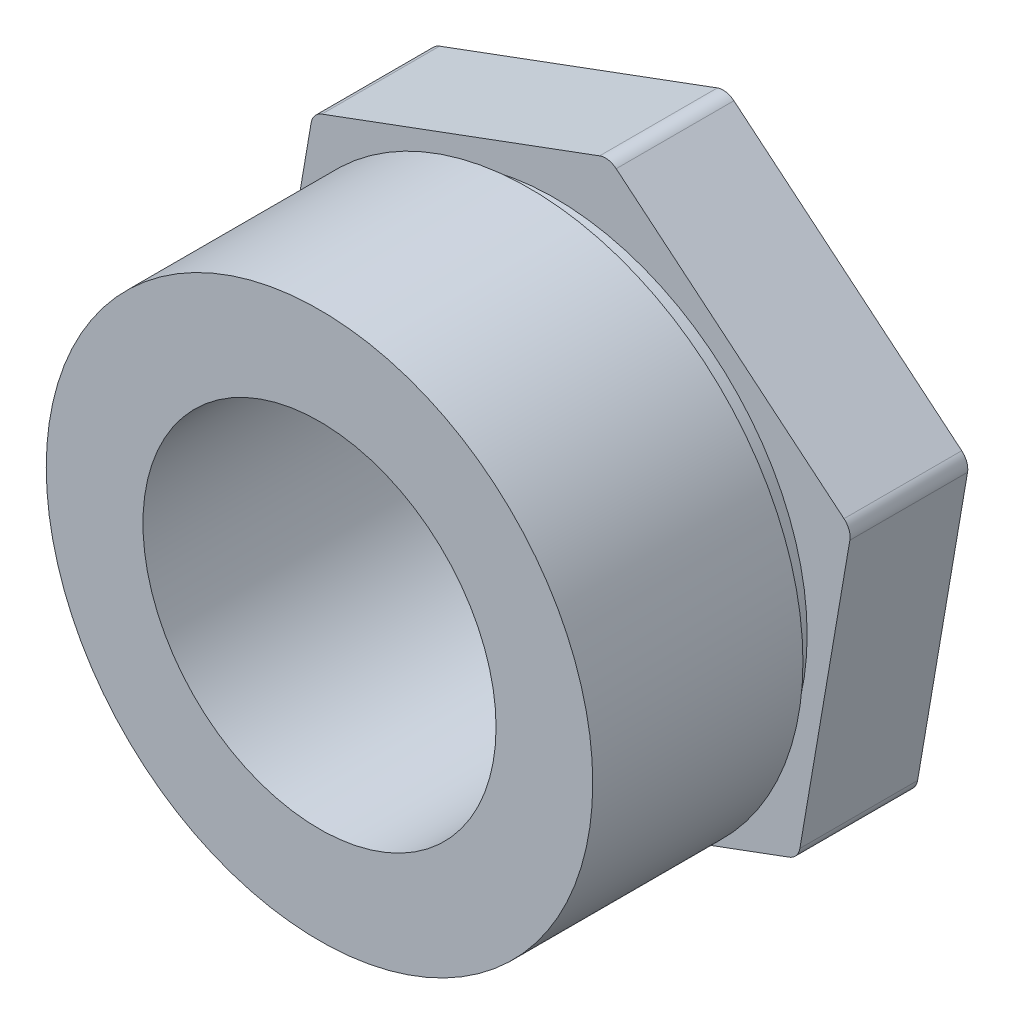
ISO-10303-21;
HEADER;
FILE_DESCRIPTION(('STEP AP214'),'2;1');
FILE_NAME('part.step','',(''),(''),'','','');
FILE_SCHEMA(('AUTOMOTIVE_DESIGN { 1 0 10303 214 1 1 1 1 }'));
ENDSEC;
DATA;
#1=APPLICATION_CONTEXT('core data for automotive mechanical design processes');
#2=APPLICATION_PROTOCOL_DEFINITION('international standard','automotive_design',2000,#1);
#3=PRODUCT_CONTEXT('',#1,'mechanical');
#4=PRODUCT('Part','Part','',(#3));
#5=PRODUCT_RELATED_PRODUCT_CATEGORY('part','',(#4));
#6=PRODUCT_DEFINITION_FORMATION('','',#4);
#7=PRODUCT_DEFINITION_CONTEXT('part definition',#1,'design');
#8=PRODUCT_DEFINITION('design','',#6,#7);
#9=PRODUCT_DEFINITION_SHAPE('','',#8);
#10=(LENGTH_UNIT() NAMED_UNIT(*) SI_UNIT(.MILLI.,.METRE.));
#11=(NAMED_UNIT(*) PLANE_ANGLE_UNIT() SI_UNIT($,.RADIAN.));
#12=(NAMED_UNIT(*) SI_UNIT($,.STERADIAN.) SOLID_ANGLE_UNIT());
#13=UNCERTAINTY_MEASURE_WITH_UNIT(LENGTH_MEASURE(1.E-05),#10,'distance_accuracy_value','');
#14=(GEOMETRIC_REPRESENTATION_CONTEXT(3) GLOBAL_UNCERTAINTY_ASSIGNED_CONTEXT((#13)) GLOBAL_UNIT_ASSIGNED_CONTEXT((#10,
#11,#12)) REPRESENTATION_CONTEXT('',''));
#15=CARTESIAN_POINT('',(0.,0.,0.));
#16=DIRECTION('',(0.,0.,1.));
#17=DIRECTION('',(1.,0.,0.));
#18=AXIS2_PLACEMENT_3D('',#15,#16,#17);
#19=CARTESIAN_POINT('',(0.,0.,42.));
#20=DIRECTION('',(0.,0.,-1.));
#21=DIRECTION('',(-1.,0.,0.));
#22=AXIS2_PLACEMENT_3D('',#19,#20,#21);
#23=CYLINDRICAL_SURFACE('',#22,32.5);
#24=CARTESIAN_POINT('',(0.,0.,14.));
#25=DIRECTION('',(0.,0.,1.));
#26=DIRECTION('',(1.,0.,0.));
#27=AXIS2_PLACEMENT_3D('',#24,#25,#26);
#28=CIRCLE('',#27,32.5);
#29=CARTESIAN_POINT('',(-24.267873622289,-21.6175926007641,14.));
#30=VERTEX_POINT('',#29);
#31=CARTESIAN_POINT('',(-16.7928416207255,-27.8253566069014,14.));
#32=VERTEX_POINT('',#31);
#33=EDGE_CURVE('E207',#30,#32,#28,.T.);
#34=ORIENTED_EDGE('',*,*,#33,.F.);
#35=DIRECTION('',(0.,0.,-1.));
#36=VECTOR('',#35,1.);
#37=CARTESIAN_POINT('',(-24.267873622289,-21.6175926007641,42.));
#38=LINE('',#37,#36);
#39=CARTESIAN_POINT('',(-24.267873622289,-21.6175926007641,0.));
#40=VERTEX_POINT('',#39);
#41=EDGE_CURVE('E215',#30,#40,#38,.T.);
#42=ORIENTED_EDGE('',*,*,#41,.T.);
#43=CARTESIAN_POINT('',(0.,0.,0.));
#44=DIRECTION('',(0.,0.,1.));
#45=DIRECTION('',(1.,0.,0.));
#46=AXIS2_PLACEMENT_3D('',#43,#44,#45);
#47=CIRCLE('',#46,32.5);
#48=CARTESIAN_POINT('',(-16.7928416207255,-27.8253566069014,0.));
#49=VERTEX_POINT('',#48);
#50=EDGE_CURVE('E163',#40,#49,#47,.T.);
#51=ORIENTED_EDGE('',*,*,#50,.T.);
#52=DIRECTION('',(0.,0.,-1.));
#53=VECTOR('',#52,1.);
#54=CARTESIAN_POINT('',(-16.7928416207255,-27.8253566069014,42.));
#55=LINE('',#54,#53);
#56=EDGE_CURVE('E174',#49,#32,#55,.F.);
#57=ORIENTED_EDGE('',*,*,#56,.T.);
#58=EDGE_LOOP('',(#34,#42,#51,#57));
#59=FACE_BOUND('',#58,.T.);
#60=ADVANCED_FACE('F39',(#59),#23,.T.);
#61=CARTESIAN_POINT('',(0.,0.,17.));
#62=DIRECTION('',(0.,0.,1.));
#63=DIRECTION('',(1.,0.,0.));
#64=AXIS2_PLACEMENT_3D('',#61,#62,#63);
#65=CIRCLE('',#64,32.5);
#66=CARTESIAN_POINT('',(-32.5,0.,17.));
#67=VERTEX_POINT('',#66);
#68=EDGE_CURVE('E164',#67,#67,#65,.T.);
#69=CARTESIAN_POINT('',(0.,0.,42.));
#70=DIRECTION('',(0.,0.,1.));
#71=DIRECTION('',(1.,0.,0.));
#72=AXIS2_PLACEMENT_3D('',#69,#70,#71);
#73=CIRCLE('',#72,32.5);
#74=CARTESIAN_POINT('',(-32.5,0.,42.));
#75=VERTEX_POINT('',#74);
#76=EDGE_CURVE('E209',#75,#75,#73,.T.);
#77=CARTESIAN_POINT('',(-32.5,0.,17.));
#78=CARTESIAN_POINT('',(-32.5,0.,17.2604166666667));
#79=CARTESIAN_POINT('',(-32.5,0.,17.5208333333333));
#80=CARTESIAN_POINT('',(-32.5,0.,18.0416666666667));
#81=CARTESIAN_POINT('',(-32.5,0.,18.3020833333333));
#82=CARTESIAN_POINT('',(-32.5,0.,18.8229166666667));
#83=CARTESIAN_POINT('',(-32.5,0.,19.0833333333333));
#84=CARTESIAN_POINT('',(-32.5,0.,19.6041666666667));
#85=CARTESIAN_POINT('',(-32.5,0.,19.8645833333333));
#86=CARTESIAN_POINT('',(-32.5,0.,20.3854166666667));
#87=CARTESIAN_POINT('',(-32.5,0.,20.6458333333333));
#88=CARTESIAN_POINT('',(-32.5,0.,21.1666666666667));
#89=CARTESIAN_POINT('',(-32.5,0.,21.4270833333333));
#90=CARTESIAN_POINT('',(-32.5,0.,21.9479166666667));
#91=CARTESIAN_POINT('',(-32.5,0.,22.2083333333333));
#92=CARTESIAN_POINT('',(-32.5,0.,22.7291666666667));
#93=CARTESIAN_POINT('',(-32.5,0.,22.9895833333333));
#94=CARTESIAN_POINT('',(-32.5,0.,23.5104166666667));
#95=CARTESIAN_POINT('',(-32.5,0.,23.7708333333333));
#96=CARTESIAN_POINT('',(-32.5,0.,24.2916666666667));
#97=CARTESIAN_POINT('',(-32.5,0.,24.5520833333333));
#98=CARTESIAN_POINT('',(-32.5,0.,25.0729166666667));
#99=CARTESIAN_POINT('',(-32.5,0.,25.3333333333333));
#100=CARTESIAN_POINT('',(-32.5,0.,25.8541666666667));
#101=CARTESIAN_POINT('',(-32.5,0.,26.1145833333333));
#102=CARTESIAN_POINT('',(-32.5,0.,26.6354166666667));
#103=CARTESIAN_POINT('',(-32.5,0.,26.8958333333333));
#104=CARTESIAN_POINT('',(-32.5,0.,27.4166666666667));
#105=CARTESIAN_POINT('',(-32.5,0.,27.6770833333333));
#106=CARTESIAN_POINT('',(-32.5,0.,28.1979166666667));
#107=CARTESIAN_POINT('',(-32.5,0.,28.4583333333333));
#108=CARTESIAN_POINT('',(-32.5,0.,28.9791666666667));
#109=CARTESIAN_POINT('',(-32.5,0.,29.2395833333333));
#110=CARTESIAN_POINT('',(-32.5,0.,29.7604166666667));
#111=CARTESIAN_POINT('',(-32.5,0.,30.0208333333333));
#112=CARTESIAN_POINT('',(-32.5,0.,30.5416666666667));
#113=CARTESIAN_POINT('',(-32.5,0.,30.8020833333333));
#114=CARTESIAN_POINT('',(-32.5,0.,31.3229166666667));
#115=CARTESIAN_POINT('',(-32.5,0.,31.5833333333333));
#116=CARTESIAN_POINT('',(-32.5,0.,32.1041666666667));
#117=CARTESIAN_POINT('',(-32.5,0.,32.3645833333333));
#118=CARTESIAN_POINT('',(-32.5,0.,32.8854166666667));
#119=CARTESIAN_POINT('',(-32.5,0.,33.1458333333333));
#120=CARTESIAN_POINT('',(-32.5,0.,33.6666666666667));
#121=CARTESIAN_POINT('',(-32.5,0.,33.9270833333333));
#122=CARTESIAN_POINT('',(-32.5,0.,34.4479166666667));
#123=CARTESIAN_POINT('',(-32.5,0.,34.7083333333333));
#124=CARTESIAN_POINT('',(-32.5,0.,35.2291666666667));
#125=CARTESIAN_POINT('',(-32.5,0.,35.4895833333333));
#126=CARTESIAN_POINT('',(-32.5,0.,36.0104166666667));
#127=CARTESIAN_POINT('',(-32.5,0.,36.2708333333333));
#128=CARTESIAN_POINT('',(-32.5,0.,36.7916666666667));
#129=CARTESIAN_POINT('',(-32.5,0.,37.0520833333333));
#130=CARTESIAN_POINT('',(-32.5,0.,37.5729166666667));
#131=CARTESIAN_POINT('',(-32.5,0.,37.8333333333333));
#132=CARTESIAN_POINT('',(-32.5,0.,38.3541666666667));
#133=CARTESIAN_POINT('',(-32.5,0.,38.6145833333333));
#134=CARTESIAN_POINT('',(-32.5,0.,39.1354166666667));
#135=CARTESIAN_POINT('',(-32.5,0.,39.3958333333333));
#136=CARTESIAN_POINT('',(-32.5,0.,39.9166666666667));
#137=CARTESIAN_POINT('',(-32.5,0.,40.1770833333333));
#138=CARTESIAN_POINT('',(-32.5,0.,40.6979166666667));
#139=CARTESIAN_POINT('',(-32.5,0.,40.9583333333333));
#140=CARTESIAN_POINT('',(-32.5,0.,41.4791666666667));
#141=CARTESIAN_POINT('',(-32.5,0.,41.7395833333333));
#142=CARTESIAN_POINT('',(-32.5,0.,42.));
#143=B_SPLINE_CURVE_WITH_KNOTS('',3,(#77,#78,#79,#80,#81,#82,#83,#84,#85,#86,#87,#88,#89,#90,
#91,#92,#93,#94,#95,#96,#97,#98,#99,#100,#101,#102,#103,#104,#105,#106,#107,#108,#109,#110,#111,
#112,#113,#114,#115,#116,#117,#118,#119,#120,#121,#122,#123,#124,#125,#126,#127,#128,#129,#130,
#131,#132,#133,#134,#135,#136,#137,#138,#139,#140,#141,#142),.UNSPECIFIED.,.F.,.F.,(4,2,2,2,2,2,
2,2,2,2,2,2,2,2,2,2,2,2,2,2,2,2,2,2,2,2,2,2,2,2,2,2,4),(0.,0.781250000000001,1.5625,2.34375,
3.125,3.90625,4.6875,5.46875,6.25,7.03125,7.8125,8.59375,9.375,10.15625,10.9375,11.71875,12.5,
13.28125,14.0625,14.84375,15.625,16.40625,17.1875,17.96875,18.75,19.53125,20.3125,21.09375,
21.875,22.65625,23.4375,24.21875,25.),.UNSPECIFIED.);
#144=EDGE_CURVE('BSEAM312',#67,#75,#143,.T.);
#145=ORIENTED_EDGE('',*,*,#68,.T.);
#146=ORIENTED_EDGE('',*,*,#76,.F.);
#147=ORIENTED_EDGE('',*,*,#144,.T.);
#148=ORIENTED_EDGE('',*,*,#144,.F.);
#149=EDGE_LOOP('',(#145,#147,#146,#148));
#150=FACE_BOUND('',#149,.T.);
#151=ADVANCED_FACE('F312',(#150),#23,.T.);
#152=CARTESIAN_POINT('',(0.,0.,42.));
#153=DIRECTION('',(0.,0.,1.));
#154=DIRECTION('',(1.,0.,0.));
#155=AXIS2_PLACEMENT_3D('',#152,#153,#154);
#156=PLANE('',#155);
#157=CARTESIAN_POINT('',(0.,0.,42.));
#158=DIRECTION('',(0.,0.,1.));
#159=DIRECTION('',(1.,0.,0.));
#160=AXIS2_PLACEMENT_3D('',#157,#158,#159);
#161=CIRCLE('',#160,21.);
#162=CARTESIAN_POINT('',(21.,0.,42.));
#163=VERTEX_POINT('',#162);
#164=EDGE_CURVE('E288',#163,#163,#161,.T.);
#165=ORIENTED_EDGE('',*,*,#164,.F.);
#166=EDGE_LOOP('',(#165));
#167=FACE_BOUND('',#166,.T.);
#168=ORIENTED_EDGE('',*,*,#76,.T.);
#169=EDGE_LOOP('',(#168));
#170=FACE_BOUND('',#169,.T.);
#171=ADVANCED_FACE('F308',(#167,#170),#156,.T.);
#172=CARTESIAN_POINT('',(0.,0.,17.));
#173=DIRECTION('',(0.,0.,1.));
#174=DIRECTION('',(1.,0.,0.));
#175=AXIS2_PLACEMENT_3D('',#172,#173,#174);
#176=PLANE('',#175);
#177=ORIENTED_EDGE('',*,*,#68,.F.);
#178=EDGE_LOOP('',(#177));
#179=FACE_BOUND('',#178,.T.);
#180=CARTESIAN_POINT('',(0.,0.,17.));
#181=DIRECTION('',(0.,0.,1.));
#182=DIRECTION('',(1.,0.,0.));
#183=AXIS2_PLACEMENT_3D('',#180,#181,#182);
#184=CIRCLE('',#183,30.);
#185=CARTESIAN_POINT('',(30.,0.,17.));
#186=VERTEX_POINT('',#185);
#187=EDGE_CURVE('E198',#186,#186,#184,.T.);
#188=ORIENTED_EDGE('',*,*,#187,.T.);
#189=EDGE_LOOP('',(#188));
#190=FACE_BOUND('',#189,.T.);
#191=ADVANCED_FACE('F311',(#179,#190),#176,.F.);
#192=CARTESIAN_POINT('',(0.,0.,14.));
#193=DIRECTION('',(0.,0.,1.));
#194=DIRECTION('',(1.,0.,0.));
#195=AXIS2_PLACEMENT_3D('',#192,#193,#194);
#196=PLANE('',#195);
#197=DIRECTION('',(-0.769304816401628,0.638881913549959,0.));
#198=VECTOR('',#197,1.);
#199=CARTESIAN_POINT('',(-6.25740760421991,-36.5746821031692,14.));
#200=LINE('',#199,#198);
#201=CARTESIAN_POINT('',(-7.14572428989662,-35.8369648136323,14.));
#202=VERTEX_POINT('',#201);
#203=EDGE_CURVE('E294',#202,#32,#200,.T.);
#204=ORIENTED_EDGE('',*,*,#203,.F.);
#205=CARTESIAN_POINT('',(-5.8679604627967,-34.2983551808291,14.));
#206=DIRECTION('',(0.,0.,1.));
#207=DIRECTION('',(1.,0.,0.));
#208=AXIS2_PLACEMENT_3D('',#205,#206,#207);
#209=CIRCLE('',#208,2.);
#210=CARTESIAN_POINT('',(-5.17436734783158,-36.1742359315361,14.));
#211=VERTEX_POINT('',#210);
#212=EDGE_CURVE('E241',#202,#211,#209,.T.);
#213=ORIENTED_EDGE('',*,*,#212,.T.);
#214=DIRECTION('',(-0.937940375353492,-0.346796557482554,0.));
#215=VECTOR('',#214,1.);
#216=CARTESIAN_POINT('',(28.9414007284003,-23.560181525091,14.));
#217=LINE('',#216,#215);
#218=CARTESIAN_POINT('',(6.58744754977973,-31.8253913531146,14.));
#219=VERTEX_POINT('',#218);
#220=EDGE_CURVE('E285',#219,#211,#217,.T.);
#221=ORIENTED_EDGE('',*,*,#220,.F.);
#222=CARTESIAN_POINT('',(15.701044880575,-28.4557057487276,14.));
#223=VERTEX_POINT('',#222);
#224=EDGE_CURVE('E170',#219,#223,#28,.T.);
#225=ORIENTED_EDGE('',*,*,#224,.T.);
#226=CARTESIAN_POINT('',(27.858360472012,-23.9606276967242,14.));
#227=VERTEX_POINT('',#226);
#228=EDGE_CURVE('E291',#227,#223,#217,.T.);
#229=ORIENTED_EDGE('',*,*,#228,.F.);
#230=CARTESIAN_POINT('',(27.1647673570469,-22.0847469460172,14.));
#231=DIRECTION('',(0.,0.,1.));
#232=DIRECTION('',(1.,0.,0.));
#233=AXIS2_PLACEMENT_3D('',#230,#231,#232);
#234=CIRCLE('',#233,2.);
#235=CARTESIAN_POINT('',(29.1361242991119,-22.4220180639209,14.));
#236=VERTEX_POINT('',#235);
#237=EDGE_CURVE('E235',#227,#236,#234,.T.);
#238=ORIENTED_EDGE('',*,*,#237,.T.);
#239=DIRECTION('',(-0.168635558951864,-0.985678471032513,0.));
#240=VECTOR('',#239,1.);
#241=CARTESIAN_POINT('',(35.2699167765274,13.4301309629366,14.));
#242=LINE('',#241,#240);
#243=CARTESIAN_POINT('',(35.0751932058158,12.2919675017665,14.));
#244=VERTEX_POINT('',#243);
#245=EDGE_CURVE('E270',#244,#236,#242,.T.);
#246=ORIENTED_EDGE('',*,*,#245,.F.);
#247=CARTESIAN_POINT('',(33.1038362637508,12.6292386196702,14.));
#248=DIRECTION('',(0.,0.,1.));
#249=DIRECTION('',(1.,0.,0.));
#250=AXIS2_PLACEMENT_3D('',#247,#248,#249);
#251=CIRCLE('',#250,2.);
#252=CARTESIAN_POINT('',(34.3816000908507,14.1678482524735,14.));
#253=VERTEX_POINT('',#252);
#254=EDGE_CURVE('E233',#244,#253,#251,.T.);
#255=ORIENTED_EDGE('',*,*,#254,.T.);
#256=DIRECTION('',(0.769304816401628,-0.638881913549959,0.));
#257=VECTOR('',#256,1.);
#258=CARTESIAN_POINT('',(6.39962449203434,37.405942872886,14.));
#259=LINE('',#258,#257);
#260=CARTESIAN_POINT('',(7.28794117771106,36.6682255833491,14.));
#261=VERTEX_POINT('',#260);
#262=EDGE_CURVE('E197',#261,#253,#259,.T.);
#263=ORIENTED_EDGE('',*,*,#262,.F.);
#264=CARTESIAN_POINT('',(6.01017735061113,35.1296159505458,14.));
#265=DIRECTION('',(0.,0.,1.));
#266=DIRECTION('',(1.,0.,0.));
#267=AXIS2_PLACEMENT_3D('',#264,#265,#266);
#268=CIRCLE('',#267,2.);
#269=CARTESIAN_POINT('',(5.31658423564603,37.0054967012528,14.));
#270=VERTEX_POINT('',#269);
#271=EDGE_CURVE('E237',#261,#270,#268,.T.);
#272=ORIENTED_EDGE('',*,*,#271,.T.);
#273=DIRECTION('',(0.937940375353492,0.346796557482553,0.));
#274=VECTOR('',#273,1.);
#275=CARTESIAN_POINT('',(-28.7991838405859,24.3914422948078,14.));
#276=LINE('',#275,#274);
#277=CARTESIAN_POINT('',(-27.7161435841976,24.7918884664409,14.));
#278=VERTEX_POINT('',#277);
#279=EDGE_CURVE('E204',#278,#270,#276,.T.);
#280=ORIENTED_EDGE('',*,*,#279,.F.);
#281=CARTESIAN_POINT('',(-27.0225504692325,22.916007715734,14.));
#282=DIRECTION('',(0.,0.,1.));
#283=DIRECTION('',(1.,0.,0.));
#284=AXIS2_PLACEMENT_3D('',#281,#282,#283);
#285=CIRCLE('',#284,2.);
#286=CARTESIAN_POINT('',(-28.9939074112975,23.2532788336377,14.));
#287=VERTEX_POINT('',#286);
#288=EDGE_CURVE('E60',#278,#287,#285,.T.);
#289=ORIENTED_EDGE('',*,*,#288,.T.);
#290=DIRECTION('',(0.168635558951864,0.985678471032513,0.));
#291=VECTOR('',#290,1.);
#292=CARTESIAN_POINT('',(-35.127699888713,-12.5988701932198,14.));
#293=LINE('',#292,#291);
#294=CARTESIAN_POINT('',(-34.9329763180014,-11.4607067320497,14.));
#295=VERTEX_POINT('',#294);
#296=EDGE_CURVE('E296',#295,#287,#293,.T.);
#297=ORIENTED_EDGE('',*,*,#296,.F.);
#298=CARTESIAN_POINT('',(-32.9616193759364,-11.7979778499535,14.));
#299=DIRECTION('',(0.,0.,1.));
#300=DIRECTION('',(1.,0.,0.));
#301=AXIS2_PLACEMENT_3D('',#298,#299,#300);
#302=CIRCLE('',#301,2.);
#303=CARTESIAN_POINT('',(-34.2393832030363,-13.3365874827567,14.));
#304=VERTEX_POINT('',#303);
#305=EDGE_CURVE('E54',#295,#304,#302,.T.);
#306=ORIENTED_EDGE('',*,*,#305,.T.);
#307=EDGE_CURVE('E293',#30,#304,#200,.T.);
#308=ORIENTED_EDGE('',*,*,#307,.F.);
#309=ORIENTED_EDGE('',*,*,#33,.T.);
#310=EDGE_LOOP('',(#204,#213,#221,#225,#229,#238,#246,#255,#263,#272,#280,#289,#297,#306,#308,#309));
#311=FACE_BOUND('',#310,.T.);
#312=CARTESIAN_POINT('',(0.,0.,14.));
#313=DIRECTION('',(0.,0.,1.));
#314=DIRECTION('',(1.,0.,0.));
#315=AXIS2_PLACEMENT_3D('',#312,#313,#314);
#316=CIRCLE('',#315,30.);
#317=CARTESIAN_POINT('',(30.,0.,14.));
#318=VERTEX_POINT('',#317);
#319=EDGE_CURVE('E201',#318,#318,#316,.T.);
#320=ORIENTED_EDGE('',*,*,#319,.F.);
#321=EDGE_LOOP('',(#320));
#322=FACE_BOUND('',#321,.T.);
#323=ADVANCED_FACE('F336',(#311,#322),#196,.T.);
#324=CARTESIAN_POINT('',(0.,0.,17.));
#325=DIRECTION('',(0.,0.,-1.));
#326=DIRECTION('',(-1.,0.,0.));
#327=AXIS2_PLACEMENT_3D('',#324,#325,#326);
#328=CYLINDRICAL_SURFACE('',#327,30.);
#329=ORIENTED_EDGE('',*,*,#187,.F.);
#330=EDGE_LOOP('',(#329));
#331=FACE_BOUND('',#330,.T.);
#332=ORIENTED_EDGE('',*,*,#319,.T.);
#333=EDGE_LOOP('',(#332));
#334=FACE_BOUND('',#333,.T.);
#335=ADVANCED_FACE('F332',(#331,#334),#328,.T.);
#336=CARTESIAN_POINT('',(0.,0.,0.));
#337=DIRECTION('',(0.,0.,1.));
#338=DIRECTION('',(1.,0.,0.));
#339=AXIS2_PLACEMENT_3D('',#336,#337,#338);
#340=PLANE('',#339);
#341=CARTESIAN_POINT('',(0.,0.,0.));
#342=DIRECTION('',(0.,0.,1.));
#343=DIRECTION('',(1.,0.,0.));
#344=AXIS2_PLACEMENT_3D('',#341,#342,#343);
#345=CIRCLE('',#344,21.);
#346=CARTESIAN_POINT('',(21.,0.,0.));
#347=VERTEX_POINT('',#346);
#348=EDGE_CURVE('E299',#347,#347,#345,.T.);
#349=ORIENTED_EDGE('',*,*,#348,.T.);
#350=EDGE_LOOP('',(#349));
#351=FACE_BOUND('',#350,.T.);
#352=DIRECTION('',(-0.937940375353492,-0.346796557482554,0.));
#353=VECTOR('',#352,1.);
#354=CARTESIAN_POINT('',(28.9414007284003,-23.560181525091,0.));
#355=LINE('',#354,#353);
#356=CARTESIAN_POINT('',(6.58744754977973,-31.8253913531146,0.));
#357=VERTEX_POINT('',#356);
#358=CARTESIAN_POINT('',(-5.17436734783158,-36.1742359315361,0.));
#359=VERTEX_POINT('',#358);
#360=EDGE_CURVE('E157',#357,#359,#355,.T.);
#361=ORIENTED_EDGE('',*,*,#360,.T.);
#362=CARTESIAN_POINT('',(-5.8679604627967,-34.2983551808291,0.));
#363=DIRECTION('',(0.,0.,1.));
#364=DIRECTION('',(1.,0.,0.));
#365=AXIS2_PLACEMENT_3D('',#362,#363,#364);
#366=CIRCLE('',#365,2.);
#367=CARTESIAN_POINT('',(-7.14572428989662,-35.8369648136323,0.));
#368=VERTEX_POINT('',#367);
#369=EDGE_CURVE('E229',#359,#368,#366,.F.);
#370=ORIENTED_EDGE('',*,*,#369,.T.);
#371=DIRECTION('',(-0.769304816401628,0.638881913549959,0.));
#372=VECTOR('',#371,1.);
#373=CARTESIAN_POINT('',(-6.25740760421991,-36.5746821031692,0.));
#374=LINE('',#373,#372);
#375=EDGE_CURVE('E189',#368,#49,#374,.T.);
#376=ORIENTED_EDGE('',*,*,#375,.T.);
#377=ORIENTED_EDGE('',*,*,#50,.F.);
#378=CARTESIAN_POINT('',(-34.2393832030363,-13.3365874827567,0.));
#379=VERTEX_POINT('',#378);
#380=EDGE_CURVE('E183',#40,#379,#374,.T.);
#381=ORIENTED_EDGE('',*,*,#380,.T.);
#382=CARTESIAN_POINT('',(-32.9616193759364,-11.7979778499535,0.));
#383=DIRECTION('',(0.,0.,1.));
#384=DIRECTION('',(1.,0.,0.));
#385=AXIS2_PLACEMENT_3D('',#382,#383,#384);
#386=CIRCLE('',#385,2.);
#387=CARTESIAN_POINT('',(-34.9329763180014,-11.4607067320497,0.));
#388=VERTEX_POINT('',#387);
#389=EDGE_CURVE('E227',#379,#388,#386,.F.);
#390=ORIENTED_EDGE('',*,*,#389,.T.);
#391=DIRECTION('',(0.168635558951864,0.985678471032513,0.));
#392=VECTOR('',#391,1.);
#393=CARTESIAN_POINT('',(-35.127699888713,-12.5988701932198,0.));
#394=LINE('',#393,#392);
#395=CARTESIAN_POINT('',(-28.9939074112975,23.2532788336377,0.));
#396=VERTEX_POINT('',#395);
#397=EDGE_CURVE('E191',#388,#396,#394,.T.);
#398=ORIENTED_EDGE('',*,*,#397,.T.);
#399=CARTESIAN_POINT('',(-27.0225504692325,22.916007715734,0.));
#400=DIRECTION('',(0.,0.,1.));
#401=DIRECTION('',(1.,0.,0.));
#402=AXIS2_PLACEMENT_3D('',#399,#400,#401);
#403=CIRCLE('',#402,2.);
#404=CARTESIAN_POINT('',(-27.7161435841976,24.7918884664409,0.));
#405=VERTEX_POINT('',#404);
#406=EDGE_CURVE('E225',#396,#405,#403,.F.);
#407=ORIENTED_EDGE('',*,*,#406,.T.);
#408=DIRECTION('',(0.937940375353492,0.346796557482553,0.));
#409=VECTOR('',#408,1.);
#410=CARTESIAN_POINT('',(-28.7991838405859,24.3914422948078,0.));
#411=LINE('',#410,#409);
#412=CARTESIAN_POINT('',(5.31658423564603,37.0054967012528,0.));
#413=VERTEX_POINT('',#412);
#414=EDGE_CURVE('E194',#405,#413,#411,.T.);
#415=ORIENTED_EDGE('',*,*,#414,.T.);
#416=CARTESIAN_POINT('',(6.01017735061113,35.1296159505458,0.));
#417=DIRECTION('',(0.,0.,1.));
#418=DIRECTION('',(1.,0.,0.));
#419=AXIS2_PLACEMENT_3D('',#416,#417,#418);
#420=CIRCLE('',#419,2.);
#421=CARTESIAN_POINT('',(7.28794117771106,36.6682255833491,0.));
#422=VERTEX_POINT('',#421);
#423=EDGE_CURVE('E223',#413,#422,#420,.F.);
#424=ORIENTED_EDGE('',*,*,#423,.T.);
#425=DIRECTION('',(0.769304816401628,-0.638881913549959,0.));
#426=VECTOR('',#425,1.);
#427=CARTESIAN_POINT('',(6.39962449203434,37.405942872886,0.));
#428=LINE('',#427,#426);
#429=CARTESIAN_POINT('',(34.3816000908507,14.1678482524735,0.));
#430=VERTEX_POINT('',#429);
#431=EDGE_CURVE('E185',#422,#430,#428,.T.);
#432=ORIENTED_EDGE('',*,*,#431,.T.);
#433=CARTESIAN_POINT('',(33.1038362637508,12.6292386196702,0.));
#434=DIRECTION('',(0.,0.,1.));
#435=DIRECTION('',(1.,0.,0.));
#436=AXIS2_PLACEMENT_3D('',#433,#434,#435);
#437=CIRCLE('',#436,2.);
#438=CARTESIAN_POINT('',(35.0751932058158,12.2919675017665,0.));
#439=VERTEX_POINT('',#438);
#440=EDGE_CURVE('E219',#430,#439,#437,.F.);
#441=ORIENTED_EDGE('',*,*,#440,.T.);
#442=DIRECTION('',(-0.168635558951864,-0.985678471032513,0.));
#443=VECTOR('',#442,1.);
#444=CARTESIAN_POINT('',(35.2699167765274,13.4301309629366,0.));
#445=LINE('',#444,#443);
#446=CARTESIAN_POINT('',(29.1361242991119,-22.4220180639209,0.));
#447=VERTEX_POINT('',#446);
#448=EDGE_CURVE('E181',#439,#447,#445,.T.);
#449=ORIENTED_EDGE('',*,*,#448,.T.);
#450=CARTESIAN_POINT('',(27.1647673570469,-22.0847469460172,0.));
#451=DIRECTION('',(0.,0.,1.));
#452=DIRECTION('',(1.,0.,0.));
#453=AXIS2_PLACEMENT_3D('',#450,#451,#452);
#454=CIRCLE('',#453,2.);
#455=CARTESIAN_POINT('',(27.858360472012,-23.9606276967242,0.));
#456=VERTEX_POINT('',#455);
#457=EDGE_CURVE('E221',#447,#456,#454,.F.);
#458=ORIENTED_EDGE('',*,*,#457,.T.);
#459=CARTESIAN_POINT('',(15.701044880575,-28.4557057487276,0.));
#460=VERTEX_POINT('',#459);
#461=EDGE_CURVE('E159',#456,#460,#355,.T.);
#462=ORIENTED_EDGE('',*,*,#461,.T.);
#463=EDGE_CURVE('E153',#357,#460,#47,.T.);
#464=ORIENTED_EDGE('',*,*,#463,.F.);
#465=EDGE_LOOP('',(#361,#370,#376,#377,#381,#390,#398,#407,#415,#424,#432,#441,#449,#458,#462,#464));
#466=FACE_BOUND('',#465,.T.);
#467=ADVANCED_FACE('F155',(#351,#466),#340,.F.);
#468=ORIENTED_EDGE('',*,*,#224,.F.);
#469=DIRECTION('',(0.,0.,-1.));
#470=VECTOR('',#469,1.);
#471=CARTESIAN_POINT('',(6.5874475497798,-31.8253913531146,42.));
#472=LINE('',#471,#470);
#473=EDGE_CURVE('E167',#219,#357,#472,.T.);
#474=ORIENTED_EDGE('',*,*,#473,.T.);
#475=ORIENTED_EDGE('',*,*,#463,.T.);
#476=DIRECTION('',(0.,0.,-1.));
#477=VECTOR('',#476,1.);
#478=CARTESIAN_POINT('',(15.701044880575,-28.4557057487276,42.));
#479=LINE('',#478,#477);
#480=EDGE_CURVE('E175',#460,#223,#479,.F.);
#481=ORIENTED_EDGE('',*,*,#480,.T.);
#482=EDGE_LOOP('',(#468,#474,#475,#481));
#483=FACE_BOUND('',#482,.T.);
#484=ADVANCED_FACE('F168',(#483),#23,.T.);
#485=CARTESIAN_POINT('',(35.2699167765274,13.4301309629366,14.));
#486=DIRECTION('',(0.985678471032513,-0.168635558951864,0.));
#487=DIRECTION('',(0.168635558951864,0.985678471032513,0.));
#488=AXIS2_PLACEMENT_3D('',#485,#486,#487);
#489=PLANE('',#488);
#490=ORIENTED_EDGE('',*,*,#245,.T.);
#491=DIRECTION('',(0.,0.,-1.));
#492=VECTOR('',#491,1.);
#493=CARTESIAN_POINT('',(29.1361242991119,-22.4220180639209,14.));
#494=LINE('',#493,#492);
#495=EDGE_CURVE('E47',#236,#447,#494,.T.);
#496=ORIENTED_EDGE('',*,*,#495,.T.);
#497=ORIENTED_EDGE('',*,*,#448,.F.);
#498=DIRECTION('',(0.,0.,-1.));
#499=VECTOR('',#498,1.);
#500=CARTESIAN_POINT('',(35.0751932058158,12.2919675017665,14.));
#501=LINE('',#500,#499);
#502=EDGE_CURVE('E261',#439,#244,#501,.F.);
#503=ORIENTED_EDGE('',*,*,#502,.T.);
#504=EDGE_LOOP('',(#490,#496,#497,#503));
#505=FACE_BOUND('',#504,.T.);
#506=ADVANCED_FACE('F267',(#505),#489,.T.);
#507=CARTESIAN_POINT('',(28.9414007284003,-23.560181525091,14.));
#508=DIRECTION('',(0.346796557482554,-0.937940375353492,0.));
#509=DIRECTION('',(0.937940375353492,0.346796557482554,0.));
#510=AXIS2_PLACEMENT_3D('',#507,#508,#509);
#511=PLANE('',#510);
#512=ORIENTED_EDGE('',*,*,#461,.F.);
#513=DIRECTION('',(0.,0.,-1.));
#514=VECTOR('',#513,1.);
#515=CARTESIAN_POINT('',(27.858360472012,-23.9606276967242,14.));
#516=LINE('',#515,#514);
#517=EDGE_CURVE('E11',#456,#227,#516,.F.);
#518=ORIENTED_EDGE('',*,*,#517,.T.);
#519=ORIENTED_EDGE('',*,*,#228,.T.);
#520=ORIENTED_EDGE('',*,*,#480,.F.);
#521=EDGE_LOOP('',(#512,#518,#519,#520));
#522=FACE_BOUND('',#521,.T.);
#523=ADVANCED_FACE('F330',(#522),#511,.T.);
#524=CARTESIAN_POINT('',(6.39962449203434,37.405942872886,14.));
#525=DIRECTION('',(0.638881913549959,0.769304816401628,0.));
#526=DIRECTION('',(-0.769304816401628,0.638881913549959,0.));
#527=AXIS2_PLACEMENT_3D('',#524,#525,#526);
#528=PLANE('',#527);
#529=ORIENTED_EDGE('',*,*,#431,.F.);
#530=DIRECTION('',(0.,0.,-1.));
#531=VECTOR('',#530,1.);
#532=CARTESIAN_POINT('',(7.28794117771105,36.6682255833491,14.));
#533=LINE('',#532,#531);
#534=EDGE_CURVE('E259',#422,#261,#533,.F.);
#535=ORIENTED_EDGE('',*,*,#534,.T.);
#536=ORIENTED_EDGE('',*,*,#262,.T.);
#537=DIRECTION('',(0.,0.,-1.));
#538=VECTOR('',#537,1.);
#539=CARTESIAN_POINT('',(34.3816000908507,14.1678482524735,14.));
#540=LINE('',#539,#538);
#541=EDGE_CURVE('E256',#253,#430,#540,.T.);
#542=ORIENTED_EDGE('',*,*,#541,.T.);
#543=EDGE_LOOP('',(#529,#535,#536,#542));
#544=FACE_BOUND('',#543,.T.);
#545=ADVANCED_FACE('F280',(#544),#528,.T.);
#546=CARTESIAN_POINT('',(-28.7991838405859,24.3914422948078,14.));
#547=DIRECTION('',(-0.346796557482553,0.937940375353492,0.));
#548=DIRECTION('',(-0.937940375353492,-0.346796557482553,0.));
#549=AXIS2_PLACEMENT_3D('',#546,#547,#548);
#550=PLANE('',#549);
#551=ORIENTED_EDGE('',*,*,#414,.F.);
#552=DIRECTION('',(0.,0.,-1.));
#553=VECTOR('',#552,1.);
#554=CARTESIAN_POINT('',(-27.7161435841976,24.7918884664409,14.));
#555=LINE('',#554,#553);
#556=EDGE_CURVE('E254',#405,#278,#555,.F.);
#557=ORIENTED_EDGE('',*,*,#556,.T.);
#558=ORIENTED_EDGE('',*,*,#279,.T.);
#559=DIRECTION('',(0.,0.,-1.));
#560=VECTOR('',#559,1.);
#561=CARTESIAN_POINT('',(5.31658423564603,37.0054967012528,14.));
#562=LINE('',#561,#560);
#563=EDGE_CURVE('E251',#270,#413,#562,.T.);
#564=ORIENTED_EDGE('',*,*,#563,.T.);
#565=EDGE_LOOP('',(#551,#557,#558,#564));
#566=FACE_BOUND('',#565,.T.);
#567=ADVANCED_FACE('F346',(#566),#550,.T.);
#568=CARTESIAN_POINT('',(-6.25740760421991,-36.5746821031692,14.));
#569=DIRECTION('',(-0.638881913549959,-0.769304816401628,0.));
#570=DIRECTION('',(0.769304816401628,-0.63888191354996,0.));
#571=AXIS2_PLACEMENT_3D('',#568,#569,#570);
#572=PLANE('',#571);
#573=ORIENTED_EDGE('',*,*,#307,.T.);
#574=DIRECTION('',(0.,0.,-1.));
#575=VECTOR('',#574,1.);
#576=CARTESIAN_POINT('',(-34.2393832030363,-13.3365874827567,14.));
#577=LINE('',#576,#575);
#578=EDGE_CURVE('E243',#304,#379,#577,.T.);
#579=ORIENTED_EDGE('',*,*,#578,.T.);
#580=ORIENTED_EDGE('',*,*,#380,.F.);
#581=ORIENTED_EDGE('',*,*,#41,.F.);
#582=EDGE_LOOP('',(#573,#579,#580,#581));
#583=FACE_BOUND('',#582,.T.);
#584=ADVANCED_FACE('F352',(#583),#572,.T.);
#585=CARTESIAN_POINT('',(-35.127699888713,-12.5988701932198,14.));
#586=DIRECTION('',(-0.985678471032513,0.168635558951864,0.));
#587=DIRECTION('',(-0.168635558951864,-0.985678471032513,0.));
#588=AXIS2_PLACEMENT_3D('',#585,#586,#587);
#589=PLANE('',#588);
#590=ORIENTED_EDGE('',*,*,#397,.F.);
#591=DIRECTION('',(0.,0.,-1.));
#592=VECTOR('',#591,1.);
#593=CARTESIAN_POINT('',(-34.9329763180014,-11.4607067320497,14.));
#594=LINE('',#593,#592);
#595=EDGE_CURVE('E249',#388,#295,#594,.F.);
#596=ORIENTED_EDGE('',*,*,#595,.T.);
#597=ORIENTED_EDGE('',*,*,#296,.T.);
#598=DIRECTION('',(0.,0.,-1.));
#599=VECTOR('',#598,1.);
#600=CARTESIAN_POINT('',(-28.9939074112975,23.2532788336377,14.));
#601=LINE('',#600,#599);
#602=EDGE_CURVE('E246',#287,#396,#601,.T.);
#603=ORIENTED_EDGE('',*,*,#602,.T.);
#604=EDGE_LOOP('',(#590,#596,#597,#603));
#605=FACE_BOUND('',#604,.T.);
#606=ADVANCED_FACE('F355',(#605),#589,.T.);
#607=ORIENTED_EDGE('',*,*,#375,.F.);
#608=DIRECTION('',(0.,0.,-1.));
#609=VECTOR('',#608,1.);
#610=CARTESIAN_POINT('',(-7.14572428989662,-35.8369648136323,14.));
#611=LINE('',#610,#609);
#612=EDGE_CURVE('E231',#368,#202,#611,.F.);
#613=ORIENTED_EDGE('',*,*,#612,.T.);
#614=ORIENTED_EDGE('',*,*,#203,.T.);
#615=ORIENTED_EDGE('',*,*,#56,.F.);
#616=EDGE_LOOP('',(#607,#613,#614,#615));
#617=FACE_BOUND('',#616,.T.);
#618=ADVANCED_FACE('F351',(#617),#572,.T.);
#619=ORIENTED_EDGE('',*,*,#220,.T.);
#620=DIRECTION('',(0.,0.,-1.));
#621=VECTOR('',#620,1.);
#622=CARTESIAN_POINT('',(-5.17436734783159,-36.1742359315361,14.));
#623=LINE('',#622,#621);
#624=EDGE_CURVE('E180',#211,#359,#623,.T.);
#625=ORIENTED_EDGE('',*,*,#624,.T.);
#626=ORIENTED_EDGE('',*,*,#360,.F.);
#627=ORIENTED_EDGE('',*,*,#473,.F.);
#628=EDGE_LOOP('',(#619,#625,#626,#627));
#629=FACE_BOUND('',#628,.T.);
#630=ADVANCED_FACE('F178',(#629),#511,.T.);
#631=CARTESIAN_POINT('',(-5.8679604627967,-34.2983551808291,14.));
#632=DIRECTION('',(0.,0.,-1.));
#633=DIRECTION('',(-1.,0.,0.));
#634=AXIS2_PLACEMENT_3D('',#631,#632,#633);
#635=CYLINDRICAL_SURFACE('',#634,2.);
#636=ORIENTED_EDGE('',*,*,#212,.F.);
#637=ORIENTED_EDGE('',*,*,#612,.F.);
#638=ORIENTED_EDGE('',*,*,#369,.F.);
#639=ORIENTED_EDGE('',*,*,#624,.F.);
#640=EDGE_LOOP('',(#636,#637,#638,#639));
#641=FACE_BOUND('',#640,.T.);
#642=ADVANCED_FACE('F350',(#641),#635,.T.);
#643=CARTESIAN_POINT('',(-32.9616193759364,-11.7979778499535,14.));
#644=DIRECTION('',(0.,0.,-1.));
#645=DIRECTION('',(-1.,0.,0.));
#646=AXIS2_PLACEMENT_3D('',#643,#644,#645);
#647=CYLINDRICAL_SURFACE('',#646,2.);
#648=ORIENTED_EDGE('',*,*,#305,.F.);
#649=ORIENTED_EDGE('',*,*,#595,.F.);
#650=ORIENTED_EDGE('',*,*,#389,.F.);
#651=ORIENTED_EDGE('',*,*,#578,.F.);
#652=EDGE_LOOP('',(#648,#649,#650,#651));
#653=FACE_BOUND('',#652,.T.);
#654=ADVANCED_FACE('F382',(#653),#647,.T.);
#655=CARTESIAN_POINT('',(-27.0225504692325,22.916007715734,14.));
#656=DIRECTION('',(0.,0.,-1.));
#657=DIRECTION('',(-1.,0.,0.));
#658=AXIS2_PLACEMENT_3D('',#655,#656,#657);
#659=CYLINDRICAL_SURFACE('',#658,2.);
#660=ORIENTED_EDGE('',*,*,#288,.F.);
#661=ORIENTED_EDGE('',*,*,#556,.F.);
#662=ORIENTED_EDGE('',*,*,#406,.F.);
#663=ORIENTED_EDGE('',*,*,#602,.F.);
#664=EDGE_LOOP('',(#660,#661,#662,#663));
#665=FACE_BOUND('',#664,.T.);
#666=ADVANCED_FACE('F376',(#665),#659,.T.);
#667=CARTESIAN_POINT('',(6.01017735061113,35.1296159505458,14.));
#668=DIRECTION('',(0.,0.,-1.));
#669=DIRECTION('',(-1.,0.,0.));
#670=AXIS2_PLACEMENT_3D('',#667,#668,#669);
#671=CYLINDRICAL_SURFACE('',#670,2.);
#672=ORIENTED_EDGE('',*,*,#271,.F.);
#673=ORIENTED_EDGE('',*,*,#534,.F.);
#674=ORIENTED_EDGE('',*,*,#423,.F.);
#675=ORIENTED_EDGE('',*,*,#563,.F.);
#676=EDGE_LOOP('',(#672,#673,#674,#675));
#677=FACE_BOUND('',#676,.T.);
#678=ADVANCED_FACE('F372',(#677),#671,.T.);
#679=CARTESIAN_POINT('',(27.1647673570469,-22.0847469460172,14.));
#680=DIRECTION('',(0.,0.,-1.));
#681=DIRECTION('',(-1.,0.,0.));
#682=AXIS2_PLACEMENT_3D('',#679,#680,#681);
#683=CYLINDRICAL_SURFACE('',#682,2.);
#684=ORIENTED_EDGE('',*,*,#237,.F.);
#685=ORIENTED_EDGE('',*,*,#517,.F.);
#686=ORIENTED_EDGE('',*,*,#457,.F.);
#687=ORIENTED_EDGE('',*,*,#495,.F.);
#688=EDGE_LOOP('',(#684,#685,#686,#687));
#689=FACE_BOUND('',#688,.T.);
#690=ADVANCED_FACE('F368',(#689),#683,.T.);
#691=CARTESIAN_POINT('',(33.1038362637508,12.6292386196702,14.));
#692=DIRECTION('',(0.,0.,-1.));
#693=DIRECTION('',(-1.,0.,0.));
#694=AXIS2_PLACEMENT_3D('',#691,#692,#693);
#695=CYLINDRICAL_SURFACE('',#694,2.);
#696=ORIENTED_EDGE('',*,*,#254,.F.);
#697=ORIENTED_EDGE('',*,*,#502,.F.);
#698=ORIENTED_EDGE('',*,*,#440,.F.);
#699=ORIENTED_EDGE('',*,*,#541,.F.);
#700=EDGE_LOOP('',(#696,#697,#698,#699));
#701=FACE_BOUND('',#700,.T.);
#702=ADVANCED_FACE('F41',(#701),#695,.T.);
#703=CARTESIAN_POINT('',(0.,0.,0.));
#704=DIRECTION('',(0.,0.,1.));
#705=DIRECTION('',(1.,0.,0.));
#706=AXIS2_PLACEMENT_3D('',#703,#704,#705);
#707=CYLINDRICAL_SURFACE('',#706,21.);
#708=CARTESIAN_POINT('',(21.,0.,0.));
#709=CARTESIAN_POINT('',(21.,0.,0.437499999999999));
#710=CARTESIAN_POINT('',(21.,0.,0.875));
#711=CARTESIAN_POINT('',(21.,0.,1.75));
#712=CARTESIAN_POINT('',(21.,0.,2.1875));
#713=CARTESIAN_POINT('',(21.,0.,3.0625));
#714=CARTESIAN_POINT('',(21.,0.,3.5));
#715=CARTESIAN_POINT('',(21.,0.,4.375));
#716=CARTESIAN_POINT('',(21.,0.,4.8125));
#717=CARTESIAN_POINT('',(21.,0.,5.6875));
#718=CARTESIAN_POINT('',(21.,0.,6.125));
#719=CARTESIAN_POINT('',(21.,0.,7.));
#720=CARTESIAN_POINT('',(21.,0.,7.4375));
#721=CARTESIAN_POINT('',(21.,0.,8.3125));
#722=CARTESIAN_POINT('',(21.,0.,8.75));
#723=CARTESIAN_POINT('',(21.,0.,9.625));
#724=CARTESIAN_POINT('',(21.,0.,10.0625));
#725=CARTESIAN_POINT('',(21.,0.,10.9375));
#726=CARTESIAN_POINT('',(21.,0.,11.375));
#727=CARTESIAN_POINT('',(21.,0.,12.25));
#728=CARTESIAN_POINT('',(21.,0.,12.6875));
#729=CARTESIAN_POINT('',(21.,0.,13.5625));
#730=CARTESIAN_POINT('',(21.,0.,14.));
#731=CARTESIAN_POINT('',(21.,0.,14.875));
#732=CARTESIAN_POINT('',(21.,0.,15.3125));
#733=CARTESIAN_POINT('',(21.,0.,16.1875));
#734=CARTESIAN_POINT('',(21.,0.,16.625));
#735=CARTESIAN_POINT('',(21.,0.,17.5));
#736=CARTESIAN_POINT('',(21.,0.,17.9375));
#737=CARTESIAN_POINT('',(21.,0.,18.8125));
#738=CARTESIAN_POINT('',(21.,0.,19.25));
#739=CARTESIAN_POINT('',(21.,0.,20.125));
#740=CARTESIAN_POINT('',(21.,0.,20.5625));
#741=CARTESIAN_POINT('',(21.,0.,21.4375));
#742=CARTESIAN_POINT('',(21.,0.,21.875));
#743=CARTESIAN_POINT('',(21.,0.,22.75));
#744=CARTESIAN_POINT('',(21.,0.,23.1875));
#745=CARTESIAN_POINT('',(21.,0.,24.0625));
#746=CARTESIAN_POINT('',(21.,0.,24.5));
#747=CARTESIAN_POINT('',(21.,0.,25.375));
#748=CARTESIAN_POINT('',(21.,0.,25.8125));
#749=CARTESIAN_POINT('',(21.,0.,26.6875));
#750=CARTESIAN_POINT('',(21.,0.,27.125));
#751=CARTESIAN_POINT('',(21.,0.,28.));
#752=CARTESIAN_POINT('',(21.,0.,28.4375));
#753=CARTESIAN_POINT('',(21.,0.,29.3125));
#754=CARTESIAN_POINT('',(21.,0.,29.75));
#755=CARTESIAN_POINT('',(21.,0.,30.625));
#756=CARTESIAN_POINT('',(21.,0.,31.0625));
#757=CARTESIAN_POINT('',(21.,0.,31.9375));
#758=CARTESIAN_POINT('',(21.,0.,32.375));
#759=CARTESIAN_POINT('',(21.,0.,33.25));
#760=CARTESIAN_POINT('',(21.,0.,33.6875));
#761=CARTESIAN_POINT('',(21.,0.,34.5625));
#762=CARTESIAN_POINT('',(21.,0.,35.));
#763=CARTESIAN_POINT('',(21.,0.,35.875));
#764=CARTESIAN_POINT('',(21.,0.,36.3125));
#765=CARTESIAN_POINT('',(21.,0.,37.1875));
#766=CARTESIAN_POINT('',(21.,0.,37.625));
#767=CARTESIAN_POINT('',(21.,0.,38.5));
#768=CARTESIAN_POINT('',(21.,0.,38.9375));
#769=CARTESIAN_POINT('',(21.,0.,39.8125));
#770=CARTESIAN_POINT('',(21.,0.,40.25));
#771=CARTESIAN_POINT('',(21.,0.,41.125));
#772=CARTESIAN_POINT('',(21.,0.,41.5625));
#773=CARTESIAN_POINT('',(21.,0.,42.));
#774=B_SPLINE_CURVE_WITH_KNOTS('',3,(#708,#709,#710,#711,#712,#713,#714,#715,#716,#717,#718,
#719,#720,#721,#722,#723,#724,#725,#726,#727,#728,#729,#730,#731,#732,#733,#734,#735,#736,#737,
#738,#739,#740,#741,#742,#743,#744,#745,#746,#747,#748,#749,#750,#751,#752,#753,#754,#755,#756,
#757,#758,#759,#760,#761,#762,#763,#764,#765,#766,#767,#768,#769,#770,#771,#772,#773),
.UNSPECIFIED.,.F.,.F.,(4,2,2,2,2,2,2,2,2,2,2,2,2,2,2,2,2,2,2,2,2,2,2,2,2,2,2,2,2,2,2,2,4),(0.,
1.3125,2.625,3.9375,5.25,6.5625,7.875,9.1875,10.5,11.8125,13.125,14.4375,15.75,17.0625,18.375,
19.6875,21.,22.3125,23.625,24.9375,26.25,27.5625,28.875,30.1875,31.5,32.8125,34.125,35.4375,
36.75,38.0625,39.375,40.6875,42.),.UNSPECIFIED.);
#775=EDGE_CURVE('BSEAM306',#347,#163,#774,.T.);
#776=ORIENTED_EDGE('',*,*,#348,.F.);
#777=ORIENTED_EDGE('',*,*,#164,.T.);
#778=ORIENTED_EDGE('',*,*,#775,.T.);
#779=ORIENTED_EDGE('',*,*,#775,.F.);
#780=EDGE_LOOP('',(#776,#778,#777,#779));
#781=FACE_BOUND('',#780,.T.);
#782=ADVANCED_FACE('F306',(#781),#707,.F.);
#783=CLOSED_SHELL('',(#60,#151,#171,#191,#323,#335,#467,#484,#506,#523,#545,#567,#584,#606,#618,
#630,#642,#654,#666,#678,#690,#702,#782));
#784=MANIFOLD_SOLID_BREP('B2',#783);
#785=ADVANCED_BREP_SHAPE_REPRESENTATION('',(#18,#784),#14);
#786=SHAPE_DEFINITION_REPRESENTATION(#9,#785);
ENDSEC;
END-ISO-10303-21;
